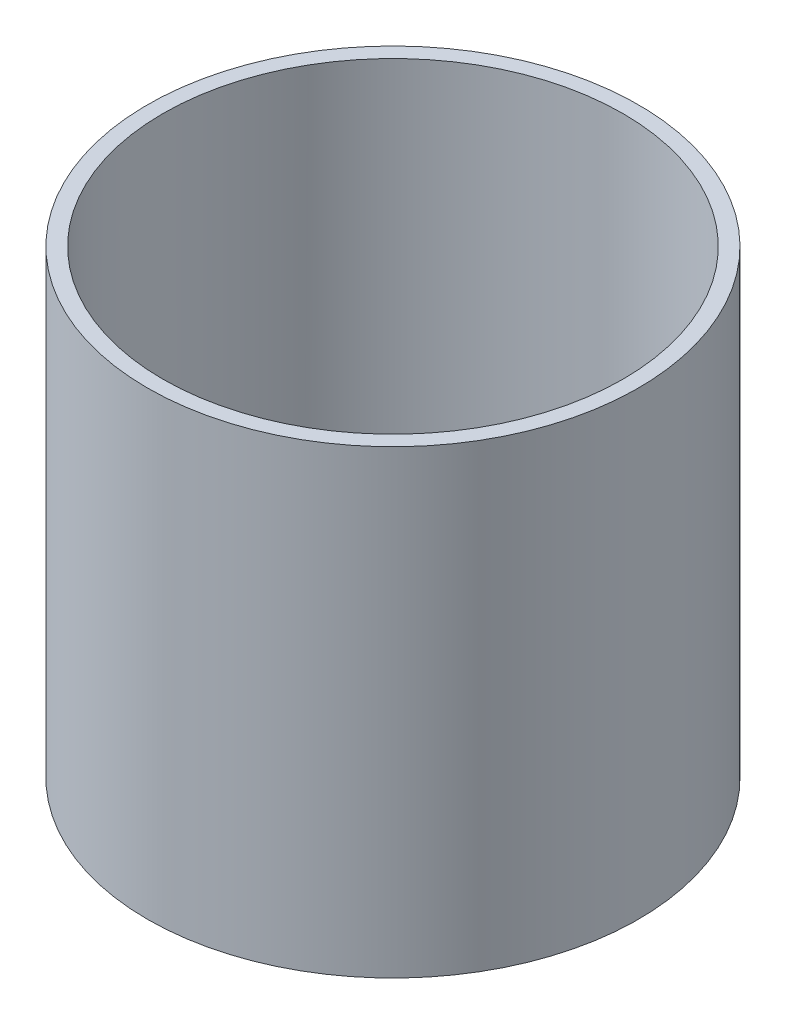
ISO-10303-21;
HEADER;
FILE_DESCRIPTION(('STEP AP214'),'2;1');
FILE_NAME('part.step','',(''),(''),'','','');
FILE_SCHEMA(('AUTOMOTIVE_DESIGN { 1 0 10303 214 1 1 1 1 }'));
ENDSEC;
DATA;
#1=APPLICATION_CONTEXT('core data for automotive mechanical design processes');
#2=APPLICATION_PROTOCOL_DEFINITION('international standard','automotive_design',2000,#1);
#3=PRODUCT_CONTEXT('',#1,'mechanical');
#4=PRODUCT('Part','Part','',(#3));
#5=PRODUCT_RELATED_PRODUCT_CATEGORY('part','',(#4));
#6=PRODUCT_DEFINITION_FORMATION('','',#4);
#7=PRODUCT_DEFINITION_CONTEXT('part definition',#1,'design');
#8=PRODUCT_DEFINITION('design','',#6,#7);
#9=PRODUCT_DEFINITION_SHAPE('','',#8);
#10=(LENGTH_UNIT() NAMED_UNIT(*) SI_UNIT(.MILLI.,.METRE.));
#11=(NAMED_UNIT(*) PLANE_ANGLE_UNIT() SI_UNIT($,.RADIAN.));
#12=(NAMED_UNIT(*) SI_UNIT($,.STERADIAN.) SOLID_ANGLE_UNIT());
#13=UNCERTAINTY_MEASURE_WITH_UNIT(LENGTH_MEASURE(1.E-05),#10,'distance_accuracy_value','');
#14=(GEOMETRIC_REPRESENTATION_CONTEXT(3) GLOBAL_UNCERTAINTY_ASSIGNED_CONTEXT((#13)) GLOBAL_UNIT_ASSIGNED_CONTEXT((#10,
#11,#12)) REPRESENTATION_CONTEXT('',''));
#15=CARTESIAN_POINT('',(0.,0.,0.));
#16=DIRECTION('',(0.,0.,1.));
#17=DIRECTION('',(1.,0.,0.));
#18=AXIS2_PLACEMENT_3D('',#15,#16,#17);
#19=CARTESIAN_POINT('',(0.,60.,0.));
#20=DIRECTION('',(0.,-1.,0.));
#21=DIRECTION('',(0.,0.,-1.));
#22=AXIS2_PLACEMENT_3D('',#19,#20,#21);
#23=CYLINDRICAL_SURFACE('',#22,30.);
#24=CARTESIAN_POINT('',(0.,11.,0.));
#25=DIRECTION('',(0.,-1.,0.));
#26=DIRECTION('',(0.,0.,-1.));
#27=AXIS2_PLACEMENT_3D('',#24,#25,#26);
#28=CIRCLE('',#27,30.);
#29=CARTESIAN_POINT('',(0.,11.,-30.));
#30=VERTEX_POINT('',#29);
#31=EDGE_CURVE('E45',#30,#30,#28,.T.);
#32=ORIENTED_EDGE('',*,*,#31,.T.);
#33=EDGE_LOOP('',(#32));
#34=FACE_BOUND('',#33,.T.);
#35=CARTESIAN_POINT('',(0.,60.,0.));
#36=DIRECTION('',(0.,1.,0.));
#37=DIRECTION('',(0.,0.,1.));
#38=AXIS2_PLACEMENT_3D('',#35,#36,#37);
#39=CIRCLE('',#38,30.);
#40=CARTESIAN_POINT('',(0.,60.,30.));
#41=VERTEX_POINT('',#40);
#42=EDGE_CURVE('E57',#41,#41,#39,.T.);
#43=ORIENTED_EDGE('',*,*,#42,.T.);
#44=EDGE_LOOP('',(#43));
#45=FACE_BOUND('',#44,.T.);
#46=ADVANCED_FACE('F38',(#34,#45),#23,.F.);
#47=CARTESIAN_POINT('',(0.,60.,0.));
#48=DIRECTION('',(0.,1.,0.));
#49=DIRECTION('',(0.,0.,1.));
#50=AXIS2_PLACEMENT_3D('',#47,#48,#49);
#51=PLANE('',#50);
#52=CARTESIAN_POINT('',(0.,60.,0.));
#53=DIRECTION('',(0.,1.,0.));
#54=DIRECTION('',(0.,0.,1.));
#55=AXIS2_PLACEMENT_3D('',#52,#53,#54);
#56=CIRCLE('',#55,32.);
#57=CARTESIAN_POINT('',(0.,60.,32.));
#58=VERTEX_POINT('',#57);
#59=EDGE_CURVE('E49',#58,#58,#56,.T.);
#60=ORIENTED_EDGE('',*,*,#59,.T.);
#61=EDGE_LOOP('',(#60));
#62=FACE_BOUND('',#61,.T.);
#63=ORIENTED_EDGE('',*,*,#42,.F.);
#64=EDGE_LOOP('',(#63));
#65=FACE_BOUND('',#64,.T.);
#66=ADVANCED_FACE('F63',(#62,#65),#51,.T.);
#67=CARTESIAN_POINT('',(0.,0.,0.));
#68=DIRECTION('',(0.,1.,0.));
#69=DIRECTION('',(0.,0.,1.));
#70=AXIS2_PLACEMENT_3D('',#67,#68,#69);
#71=PLANE('',#70);
#72=CARTESIAN_POINT('',(0.,0.,0.));
#73=DIRECTION('',(0.,1.,0.));
#74=DIRECTION('',(0.,0.,1.));
#75=AXIS2_PLACEMENT_3D('',#72,#73,#74);
#76=CIRCLE('',#75,32.);
#77=CARTESIAN_POINT('',(0.,0.,32.));
#78=VERTEX_POINT('',#77);
#79=EDGE_CURVE('E53',#78,#78,#76,.T.);
#80=ORIENTED_EDGE('',*,*,#79,.F.);
#81=EDGE_LOOP('',(#80));
#82=FACE_BOUND('',#81,.T.);
#83=ADVANCED_FACE('F65',(#82),#71,.F.);
#84=CARTESIAN_POINT('',(0.,60.,0.));
#85=DIRECTION('',(0.,-1.,0.));
#86=DIRECTION('',(0.,0.,-1.));
#87=AXIS2_PLACEMENT_3D('',#84,#85,#86);
#88=CYLINDRICAL_SURFACE('',#87,32.);
#89=ORIENTED_EDGE('',*,*,#79,.T.);
#90=EDGE_LOOP('',(#89));
#91=FACE_BOUND('',#90,.T.);
#92=ORIENTED_EDGE('',*,*,#59,.F.);
#93=EDGE_LOOP('',(#92));
#94=FACE_BOUND('',#93,.T.);
#95=ADVANCED_FACE('F73',(#91,#94),#88,.T.);
#96=CARTESIAN_POINT('',(0.,1.,0.));
#97=DIRECTION('',(0.,-1.,0.));
#98=DIRECTION('',(0.,0.,-1.));
#99=AXIS2_PLACEMENT_3D('',#96,#97,#98);
#100=PLANE('',#99);
#101=CARTESIAN_POINT('',(0.,1.,0.));
#102=DIRECTION('',(0.,-1.,0.));
#103=DIRECTION('',(0.,0.,-1.));
#104=AXIS2_PLACEMENT_3D('',#101,#102,#103);
#105=CIRCLE('',#104,20.);
#106=CARTESIAN_POINT('',(0.,1.,-20.));
#107=VERTEX_POINT('',#106);
#108=EDGE_CURVE('E10',#107,#107,#105,.F.);
#109=ORIENTED_EDGE('',*,*,#108,.T.);
#110=EDGE_LOOP('',(#109));
#111=FACE_BOUND('',#110,.T.);
#112=ADVANCED_FACE('F80',(#111),#100,.F.);
#113=CARTESIAN_POINT('',(0.,11.,0.));
#114=DIRECTION('',(0.,-1.,0.));
#115=DIRECTION('',(0.,0.,-1.));
#116=AXIS2_PLACEMENT_3D('',#113,#114,#115);
#117=TOROIDAL_SURFACE('',#116,20.,10.);
#118=ORIENTED_EDGE('',*,*,#108,.F.);
#119=EDGE_LOOP('',(#118));
#120=FACE_BOUND('',#119,.T.);
#121=ORIENTED_EDGE('',*,*,#31,.F.);
#122=EDGE_LOOP('',(#121));
#123=FACE_BOUND('',#122,.T.);
#124=ADVANCED_FACE('F40',(#120,#123),#117,.F.);
#125=CLOSED_SHELL('',(#46,#66,#83,#95,#112,#124));
#126=MANIFOLD_SOLID_BREP('B2',#125);
#127=ADVANCED_BREP_SHAPE_REPRESENTATION('',(#18,#126),#14);
#128=SHAPE_DEFINITION_REPRESENTATION(#9,#127);
ENDSEC;
END-ISO-10303-21;
